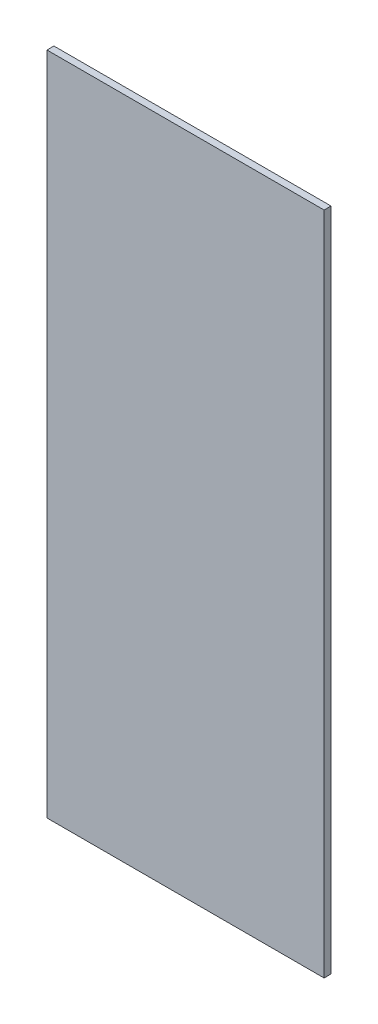
ISO-10303-21;
HEADER;
FILE_DESCRIPTION(('STEP AP214'),'2;1');
FILE_NAME('part.step','',(''),(''),'','','');
FILE_SCHEMA(('AUTOMOTIVE_DESIGN { 1 0 10303 214 1 1 1 1 }'));
ENDSEC;
DATA;
#1=APPLICATION_CONTEXT('core data for automotive mechanical design processes');
#2=APPLICATION_PROTOCOL_DEFINITION('international standard','automotive_design',2000,#1);
#3=PRODUCT_CONTEXT('',#1,'mechanical');
#4=PRODUCT('Part','Part','',(#3));
#5=PRODUCT_RELATED_PRODUCT_CATEGORY('part','',(#4));
#6=PRODUCT_DEFINITION_FORMATION('','',#4);
#7=PRODUCT_DEFINITION_CONTEXT('part definition',#1,'design');
#8=PRODUCT_DEFINITION('design','',#6,#7);
#9=PRODUCT_DEFINITION_SHAPE('','',#8);
#10=(LENGTH_UNIT() NAMED_UNIT(*) SI_UNIT(.MILLI.,.METRE.));
#11=(NAMED_UNIT(*) PLANE_ANGLE_UNIT() SI_UNIT($,.RADIAN.));
#12=(NAMED_UNIT(*) SI_UNIT($,.STERADIAN.) SOLID_ANGLE_UNIT());
#13=UNCERTAINTY_MEASURE_WITH_UNIT(LENGTH_MEASURE(1.E-05),#10,'distance_accuracy_value','');
#14=(GEOMETRIC_REPRESENTATION_CONTEXT(3) GLOBAL_UNCERTAINTY_ASSIGNED_CONTEXT((#13)) GLOBAL_UNIT_ASSIGNED_CONTEXT((#10,
#11,#12)) REPRESENTATION_CONTEXT('',''));
#15=CARTESIAN_POINT('',(0.,0.,0.));
#16=DIRECTION('',(0.,0.,1.));
#17=DIRECTION('',(1.,0.,0.));
#18=AXIS2_PLACEMENT_3D('',#15,#16,#17);
#19=CARTESIAN_POINT('',(63.4999999999999,152.4,1.5875));
#20=DIRECTION('',(-1.,0.,0.));
#21=DIRECTION('',(0.,-1.,0.));
#22=AXIS2_PLACEMENT_3D('',#19,#20,#21);
#23=PLANE('',#22);
#24=DIRECTION('',(0.,1.,0.));
#25=VECTOR('',#24,1.);
#26=CARTESIAN_POINT('',(63.4999999999999,152.4,-1.5875));
#27=LINE('',#26,#25);
#28=CARTESIAN_POINT('',(63.4999999999999,-152.4,-1.5875));
#29=VERTEX_POINT('',#28);
#30=CARTESIAN_POINT('',(63.4999999999999,152.4,-1.5875));
#31=VERTEX_POINT('',#30);
#32=EDGE_CURVE('E107',#29,#31,#27,.T.);
#33=ORIENTED_EDGE('',*,*,#32,.T.);
#34=DIRECTION('',(0.,0.,-1.));
#35=VECTOR('',#34,1.);
#36=CARTESIAN_POINT('',(63.4999999999999,152.4,1.5875));
#37=LINE('',#36,#35);
#38=CARTESIAN_POINT('',(63.4999999999999,152.4,1.5875));
#39=VERTEX_POINT('',#38);
#40=EDGE_CURVE('E11',#39,#31,#37,.T.);
#41=ORIENTED_EDGE('',*,*,#40,.F.);
#42=DIRECTION('',(0.,1.,0.));
#43=VECTOR('',#42,1.);
#44=CARTESIAN_POINT('',(63.4999999999999,152.4,1.5875));
#45=LINE('',#44,#43);
#46=CARTESIAN_POINT('',(63.4999999999999,-152.4,1.5875));
#47=VERTEX_POINT('',#46);
#48=EDGE_CURVE('E91',#47,#39,#45,.T.);
#49=ORIENTED_EDGE('',*,*,#48,.F.);
#50=DIRECTION('',(0.,0.,-1.));
#51=VECTOR('',#50,1.);
#52=CARTESIAN_POINT('',(63.4999999999999,-152.4,1.5875));
#53=LINE('',#52,#51);
#54=EDGE_CURVE('E103',#47,#29,#53,.T.);
#55=ORIENTED_EDGE('',*,*,#54,.T.);
#56=EDGE_LOOP('',(#33,#41,#49,#55));
#57=FACE_BOUND('',#56,.T.);
#58=ADVANCED_FACE('F39',(#57),#23,.F.);
#59=CARTESIAN_POINT('',(-63.5000000000001,152.4,1.5875));
#60=DIRECTION('',(0.,-1.,0.));
#61=DIRECTION('',(0.,0.,-1.));
#62=AXIS2_PLACEMENT_3D('',#59,#60,#61);
#63=PLANE('',#62);
#64=DIRECTION('',(-1.,0.,0.));
#65=VECTOR('',#64,1.);
#66=CARTESIAN_POINT('',(-63.5000000000001,152.4,-1.5875));
#67=LINE('',#66,#65);
#68=CARTESIAN_POINT('',(-63.5000000000001,152.4,-1.5875));
#69=VERTEX_POINT('',#68);
#70=EDGE_CURVE('E96',#31,#69,#67,.T.);
#71=ORIENTED_EDGE('',*,*,#70,.T.);
#72=DIRECTION('',(0.,0.,-1.));
#73=VECTOR('',#72,1.);
#74=CARTESIAN_POINT('',(-63.5000000000001,152.4,1.5875));
#75=LINE('',#74,#73);
#76=CARTESIAN_POINT('',(-63.5000000000001,152.4,1.5875));
#77=VERTEX_POINT('',#76);
#78=EDGE_CURVE('E48',#77,#69,#75,.T.);
#79=ORIENTED_EDGE('',*,*,#78,.F.);
#80=DIRECTION('',(-1.,0.,0.));
#81=VECTOR('',#80,1.);
#82=CARTESIAN_POINT('',(-63.5000000000001,152.4,1.5875));
#83=LINE('',#82,#81);
#84=EDGE_CURVE('E86',#39,#77,#83,.T.);
#85=ORIENTED_EDGE('',*,*,#84,.F.);
#86=ORIENTED_EDGE('',*,*,#40,.T.);
#87=EDGE_LOOP('',(#71,#79,#85,#86));
#88=FACE_BOUND('',#87,.T.);
#89=ADVANCED_FACE('F95',(#88),#63,.F.);
#90=CARTESIAN_POINT('',(-63.5000000000001,152.4,1.5875));
#91=DIRECTION('',(1.,0.,0.));
#92=DIRECTION('',(0.,1.,0.));
#93=AXIS2_PLACEMENT_3D('',#90,#91,#92);
#94=PLANE('',#93);
#95=DIRECTION('',(0.,-1.,0.));
#96=VECTOR('',#95,1.);
#97=CARTESIAN_POINT('',(-63.5000000000001,152.4,-1.5875));
#98=LINE('',#97,#96);
#99=CARTESIAN_POINT('',(-63.5,-152.4,-1.5875));
#100=VERTEX_POINT('',#99);
#101=EDGE_CURVE('E73',#69,#100,#98,.T.);
#102=ORIENTED_EDGE('',*,*,#101,.T.);
#103=DIRECTION('',(0.,0.,-1.));
#104=VECTOR('',#103,1.);
#105=CARTESIAN_POINT('',(-63.5,-152.4,1.5875));
#106=LINE('',#105,#104);
#107=CARTESIAN_POINT('',(-63.5,-152.4,1.5875));
#108=VERTEX_POINT('',#107);
#109=EDGE_CURVE('E98',#108,#100,#106,.T.);
#110=ORIENTED_EDGE('',*,*,#109,.F.);
#111=DIRECTION('',(0.,-1.,0.));
#112=VECTOR('',#111,1.);
#113=CARTESIAN_POINT('',(-63.5000000000001,152.4,1.5875));
#114=LINE('',#113,#112);
#115=EDGE_CURVE('E89',#77,#108,#114,.T.);
#116=ORIENTED_EDGE('',*,*,#115,.F.);
#117=ORIENTED_EDGE('',*,*,#78,.T.);
#118=EDGE_LOOP('',(#102,#110,#116,#117));
#119=FACE_BOUND('',#118,.T.);
#120=ADVANCED_FACE('F99',(#119),#94,.F.);
#121=CARTESIAN_POINT('',(-63.5,-152.4,1.5875));
#122=DIRECTION('',(0.,1.,0.));
#123=DIRECTION('',(0.,0.,1.));
#124=AXIS2_PLACEMENT_3D('',#121,#122,#123);
#125=PLANE('',#124);
#126=DIRECTION('',(1.,0.,0.));
#127=VECTOR('',#126,1.);
#128=CARTESIAN_POINT('',(-63.5,-152.4,-1.5875));
#129=LINE('',#128,#127);
#130=EDGE_CURVE('E79',#100,#29,#129,.T.);
#131=ORIENTED_EDGE('',*,*,#130,.T.);
#132=ORIENTED_EDGE('',*,*,#54,.F.);
#133=DIRECTION('',(1.,0.,0.));
#134=VECTOR('',#133,1.);
#135=CARTESIAN_POINT('',(-63.5,-152.4,1.5875));
#136=LINE('',#135,#134);
#137=EDGE_CURVE('E56',#108,#47,#136,.T.);
#138=ORIENTED_EDGE('',*,*,#137,.F.);
#139=ORIENTED_EDGE('',*,*,#109,.T.);
#140=EDGE_LOOP('',(#131,#132,#138,#139));
#141=FACE_BOUND('',#140,.T.);
#142=ADVANCED_FACE('F120',(#141),#125,.F.);
#143=CARTESIAN_POINT('',(0.,0.,1.5875));
#144=DIRECTION('',(0.,0.,1.));
#145=DIRECTION('',(1.,0.,0.));
#146=AXIS2_PLACEMENT_3D('',#143,#144,#145);
#147=PLANE('',#146);
#148=ORIENTED_EDGE('',*,*,#48,.T.);
#149=ORIENTED_EDGE('',*,*,#84,.T.);
#150=ORIENTED_EDGE('',*,*,#115,.T.);
#151=ORIENTED_EDGE('',*,*,#137,.T.);
#152=EDGE_LOOP('',(#148,#149,#150,#151));
#153=FACE_BOUND('',#152,.T.);
#154=ADVANCED_FACE('F87',(#153),#147,.T.);
#155=CARTESIAN_POINT('',(0.,0.,-1.5875));
#156=DIRECTION('',(0.,0.,1.));
#157=DIRECTION('',(1.,0.,0.));
#158=AXIS2_PLACEMENT_3D('',#155,#156,#157);
#159=PLANE('',#158);
#160=ORIENTED_EDGE('',*,*,#32,.F.);
#161=ORIENTED_EDGE('',*,*,#130,.F.);
#162=ORIENTED_EDGE('',*,*,#101,.F.);
#163=ORIENTED_EDGE('',*,*,#70,.F.);
#164=EDGE_LOOP('',(#160,#161,#162,#163));
#165=FACE_BOUND('',#164,.T.);
#166=ADVANCED_FACE('F123',(#165),#159,.F.);
#167=CLOSED_SHELL('',(#58,#89,#120,#142,#154,#166));
#168=MANIFOLD_SOLID_BREP('B2',#167);
#169=ADVANCED_BREP_SHAPE_REPRESENTATION('',(#18,#168),#14);
#170=SHAPE_DEFINITION_REPRESENTATION(#9,#169);
ENDSEC;
END-ISO-10303-21;
